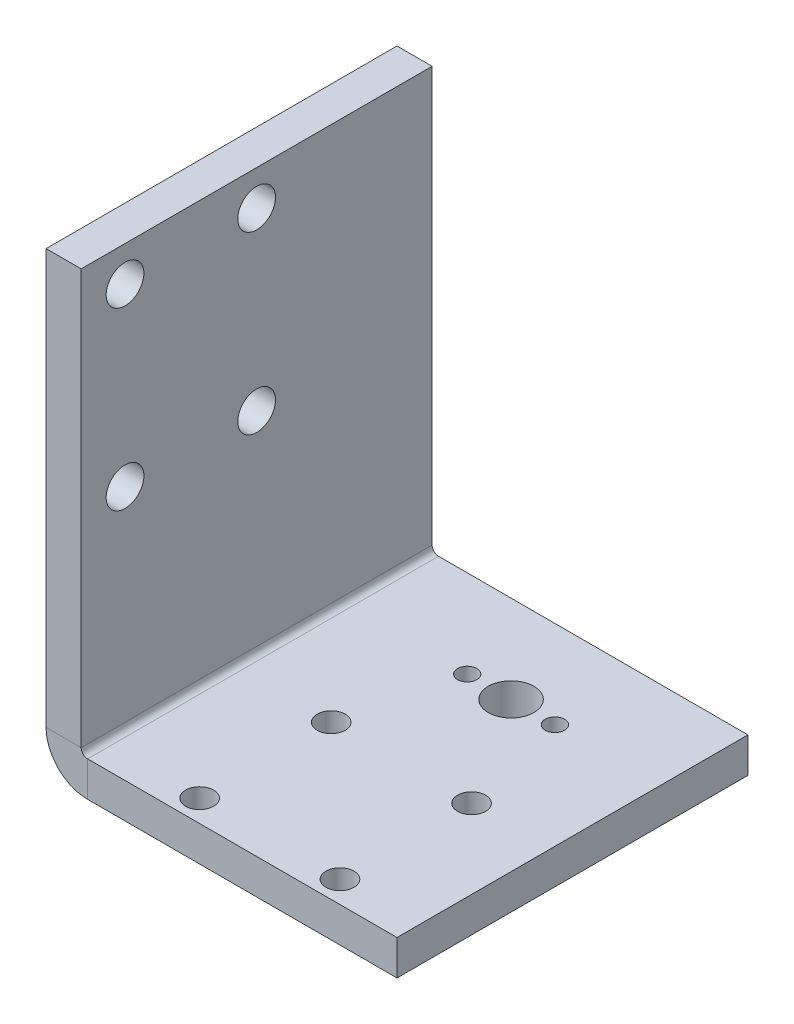
ISO-10303-21;
HEADER;
FILE_DESCRIPTION(('STEP AP214'),'2;1');
FILE_NAME('part.step','',(''),(''),'','','');
FILE_SCHEMA(('AUTOMOTIVE_DESIGN { 1 0 10303 214 1 1 1 1 }'));
ENDSEC;
DATA;
#1=APPLICATION_CONTEXT('core data for automotive mechanical design processes');
#2=APPLICATION_PROTOCOL_DEFINITION('international standard','automotive_design',2000,#1);
#3=PRODUCT_CONTEXT('',#1,'mechanical');
#4=PRODUCT('Part','Part','',(#3));
#5=PRODUCT_RELATED_PRODUCT_CATEGORY('part','',(#4));
#6=PRODUCT_DEFINITION_FORMATION('','',#4);
#7=PRODUCT_DEFINITION_CONTEXT('part definition',#1,'design');
#8=PRODUCT_DEFINITION('design','',#6,#7);
#9=PRODUCT_DEFINITION_SHAPE('','',#8);
#10=(LENGTH_UNIT() NAMED_UNIT(*) SI_UNIT(.MILLI.,.METRE.));
#11=(NAMED_UNIT(*) PLANE_ANGLE_UNIT() SI_UNIT($,.RADIAN.));
#12=(NAMED_UNIT(*) SI_UNIT($,.STERADIAN.) SOLID_ANGLE_UNIT());
#13=UNCERTAINTY_MEASURE_WITH_UNIT(LENGTH_MEASURE(1.E-05),#10,'distance_accuracy_value','');
#14=(GEOMETRIC_REPRESENTATION_CONTEXT(3) GLOBAL_UNCERTAINTY_ASSIGNED_CONTEXT((#13)) GLOBAL_UNIT_ASSIGNED_CONTEXT((#10,
#11,#12)) REPRESENTATION_CONTEXT('',''));
#15=CARTESIAN_POINT('',(0.,0.,0.));
#16=DIRECTION('',(0.,0.,1.));
#17=DIRECTION('',(1.,0.,0.));
#18=AXIS2_PLACEMENT_3D('',#15,#16,#17);
#19=CARTESIAN_POINT('',(0.7366,0.,20.));
#20=DIRECTION('',(0.,0.,1.));
#21=DIRECTION('',(1.,0.,0.));
#22=AXIS2_PLACEMENT_3D('',#19,#20,#21);
#23=PLANE('',#22);
#24=DIRECTION('',(0.,-1.,0.));
#25=VECTOR('',#24,1.);
#26=CARTESIAN_POINT('',(0.7366,0.,20.));
#27=LINE('',#26,#25);
#28=CARTESIAN_POINT('',(0.7366,0.,20.));
#29=VERTEX_POINT('',#28);
#30=CARTESIAN_POINT('',(0.7366,-4.,20.));
#31=VERTEX_POINT('',#30);
#32=EDGE_CURVE('E11',#29,#31,#27,.T.);
#33=ORIENTED_EDGE('',*,*,#32,.F.);
#34=CARTESIAN_POINT('',(0.7366,0.7366,20.));
#35=DIRECTION('',(0.,0.,-1.));
#36=DIRECTION('',(-1.,0.,0.));
#37=AXIS2_PLACEMENT_3D('',#34,#35,#36);
#38=CIRCLE('',#37,0.7366);
#39=CARTESIAN_POINT('',(0.,0.7366,20.));
#40=VERTEX_POINT('',#39);
#41=EDGE_CURVE('E138',#40,#29,#38,.F.);
#42=ORIENTED_EDGE('',*,*,#41,.F.);
#43=DIRECTION('',(1.,0.,0.));
#44=VECTOR('',#43,1.);
#45=CARTESIAN_POINT('',(-4.,0.736600000000001,20.));
#46=LINE('',#45,#44);
#47=CARTESIAN_POINT('',(-4.,0.736600000000001,20.));
#48=VERTEX_POINT('',#47);
#49=EDGE_CURVE('E48',#48,#40,#46,.T.);
#50=ORIENTED_EDGE('',*,*,#49,.F.);
#51=CARTESIAN_POINT('',(0.7366,0.7366,20.));
#52=DIRECTION('',(0.,0.,1.));
#53=DIRECTION('',(1.,0.,0.));
#54=AXIS2_PLACEMENT_3D('',#51,#52,#53);
#55=CIRCLE('',#54,4.7366);
#56=EDGE_CURVE('E131',#48,#31,#55,.T.);
#57=ORIENTED_EDGE('',*,*,#56,.T.);
#58=EDGE_LOOP('',(#33,#42,#50,#57));
#59=FACE_BOUND('',#58,.T.);
#60=ADVANCED_FACE('F39',(#59),#23,.T.);
#61=CARTESIAN_POINT('',(-4.,0.736600000000001,20.));
#62=DIRECTION('',(0.,0.,1.));
#63=DIRECTION('',(1.,0.,0.));
#64=AXIS2_PLACEMENT_3D('',#61,#62,#63);
#65=PLANE('',#64);
#66=DIRECTION('',(1.,0.,0.));
#67=VECTOR('',#66,1.);
#68=CARTESIAN_POINT('',(0.,0.,20.));
#69=LINE('',#68,#67);
#70=CARTESIAN_POINT('',(36.,0.,20.));
#71=VERTEX_POINT('',#70);
#72=EDGE_CURVE('E221',#29,#71,#69,.T.);
#73=ORIENTED_EDGE('',*,*,#72,.F.);
#74=ORIENTED_EDGE('',*,*,#32,.T.);
#75=DIRECTION('',(1.,0.,0.));
#76=VECTOR('',#75,1.);
#77=CARTESIAN_POINT('',(0.,-4.,20.));
#78=LINE('',#77,#76);
#79=CARTESIAN_POINT('',(36.,-4.,20.));
#80=VERTEX_POINT('',#79);
#81=EDGE_CURVE('E97',#31,#80,#78,.T.);
#82=ORIENTED_EDGE('',*,*,#81,.T.);
#83=DIRECTION('',(0.,-1.,0.));
#84=VECTOR('',#83,1.);
#85=CARTESIAN_POINT('',(36.,0.,20.));
#86=LINE('',#85,#84);
#87=EDGE_CURVE('E218',#71,#80,#86,.T.);
#88=ORIENTED_EDGE('',*,*,#87,.F.);
#89=EDGE_LOOP('',(#73,#74,#82,#88));
#90=FACE_BOUND('',#89,.T.);
#91=ADVANCED_FACE('F241',(#90),#65,.T.);
#92=CARTESIAN_POINT('',(0.,0.7366,-20.));
#93=DIRECTION('',(0.,0.,-1.));
#94=DIRECTION('',(-1.,0.,0.));
#95=AXIS2_PLACEMENT_3D('',#92,#93,#94);
#96=PLANE('',#95);
#97=DIRECTION('',(-1.,0.,0.));
#98=VECTOR('',#97,1.);
#99=CARTESIAN_POINT('',(0.,0.7366,-20.));
#100=LINE('',#99,#98);
#101=CARTESIAN_POINT('',(0.,0.7366,-20.));
#102=VERTEX_POINT('',#101);
#103=CARTESIAN_POINT('',(-4.,0.736600000000001,-20.));
#104=VERTEX_POINT('',#103);
#105=EDGE_CURVE('E84',#102,#104,#100,.T.);
#106=ORIENTED_EDGE('',*,*,#105,.F.);
#107=CARTESIAN_POINT('',(0.7366,0.7366,-20.));
#108=DIRECTION('',(0.,0.,-1.));
#109=DIRECTION('',(-1.,0.,0.));
#110=AXIS2_PLACEMENT_3D('',#107,#108,#109);
#111=CIRCLE('',#110,0.7366);
#112=CARTESIAN_POINT('',(0.7366,0.,-20.));
#113=VERTEX_POINT('',#112);
#114=EDGE_CURVE('E154',#102,#113,#111,.F.);
#115=ORIENTED_EDGE('',*,*,#114,.T.);
#116=DIRECTION('',(0.,1.,0.));
#117=VECTOR('',#116,1.);
#118=CARTESIAN_POINT('',(0.7366,-4.,-20.));
#119=LINE('',#118,#117);
#120=CARTESIAN_POINT('',(0.7366,-4.,-20.));
#121=VERTEX_POINT('',#120);
#122=EDGE_CURVE('E91',#121,#113,#119,.T.);
#123=ORIENTED_EDGE('',*,*,#122,.F.);
#124=CARTESIAN_POINT('',(0.7366,0.7366,-20.));
#125=DIRECTION('',(0.,0.,1.));
#126=DIRECTION('',(1.,0.,0.));
#127=AXIS2_PLACEMENT_3D('',#124,#125,#126);
#128=CIRCLE('',#127,4.7366);
#129=EDGE_CURVE('E161',#104,#121,#128,.T.);
#130=ORIENTED_EDGE('',*,*,#129,.F.);
#131=EDGE_LOOP('',(#106,#115,#123,#130));
#132=FACE_BOUND('',#131,.T.);
#133=ADVANCED_FACE('F239',(#132),#96,.T.);
#134=CARTESIAN_POINT('',(0.7366,-4.,-20.));
#135=DIRECTION('',(0.,0.,-1.));
#136=DIRECTION('',(-1.,0.,0.));
#137=AXIS2_PLACEMENT_3D('',#134,#135,#136);
#138=PLANE('',#137);
#139=DIRECTION('',(0.,-1.,0.));
#140=VECTOR('',#139,1.);
#141=CARTESIAN_POINT('',(0.,0.,-20.));
#142=LINE('',#141,#140);
#143=CARTESIAN_POINT('',(0.,48.,-20.));
#144=VERTEX_POINT('',#143);
#145=EDGE_CURVE('E156',#144,#102,#142,.T.);
#146=ORIENTED_EDGE('',*,*,#145,.T.);
#147=ORIENTED_EDGE('',*,*,#105,.T.);
#148=DIRECTION('',(0.,1.,0.));
#149=VECTOR('',#148,1.);
#150=CARTESIAN_POINT('',(-4.,0.,-20.));
#151=LINE('',#150,#149);
#152=CARTESIAN_POINT('',(-4.,48.,-20.));
#153=VERTEX_POINT('',#152);
#154=EDGE_CURVE('E159',#153,#104,#151,.F.);
#155=ORIENTED_EDGE('',*,*,#154,.F.);
#156=DIRECTION('',(1.,0.,0.));
#157=VECTOR('',#156,1.);
#158=CARTESIAN_POINT('',(-4.,48.,-20.));
#159=LINE('',#158,#157);
#160=EDGE_CURVE('E119',#153,#144,#159,.T.);
#161=ORIENTED_EDGE('',*,*,#160,.T.);
#162=EDGE_LOOP('',(#146,#147,#155,#161));
#163=FACE_BOUND('',#162,.T.);
#164=ADVANCED_FACE('F235',(#163),#138,.T.);
#165=CARTESIAN_POINT('',(0.,-4.,20.));
#166=DIRECTION('',(0.,1.,0.));
#167=DIRECTION('',(0.,0.,1.));
#168=AXIS2_PLACEMENT_3D('',#165,#166,#167);
#169=PLANE('',#168);
#170=CARTESIAN_POINT('',(14.,-4.,-10.));
#171=DIRECTION('',(0.,-1.,0.));
#172=DIRECTION('',(0.,0.,-1.));
#173=AXIS2_PLACEMENT_3D('',#170,#171,#172);
#174=CIRCLE('',#173,1.09999999999999);
#175=CARTESIAN_POINT('',(14.,-4.,-11.1));
#176=VERTEX_POINT('',#175);
#177=EDGE_CURVE('E488',#176,#176,#174,.T.);
#178=ORIENTED_EDGE('',*,*,#177,.F.);
#179=EDGE_LOOP('',(#178));
#180=FACE_BOUND('',#179,.T.);
#181=CARTESIAN_POINT('',(24.,-4.,-10.));
#182=DIRECTION('',(0.,-1.,0.));
#183=DIRECTION('',(0.,0.,-1.));
#184=AXIS2_PLACEMENT_3D('',#181,#182,#183);
#185=CIRCLE('',#184,1.09999999999999);
#186=CARTESIAN_POINT('',(24.,-4.,-11.1));
#187=VERTEX_POINT('',#186);
#188=EDGE_CURVE('E490',#187,#187,#185,.T.);
#189=ORIENTED_EDGE('',*,*,#188,.F.);
#190=EDGE_LOOP('',(#189));
#191=FACE_BOUND('',#190,.T.);
#192=CARTESIAN_POINT('',(19.,-4.,-10.));
#193=DIRECTION('',(0.,-1.,0.));
#194=DIRECTION('',(0.,0.,-1.));
#195=AXIS2_PLACEMENT_3D('',#192,#193,#194);
#196=CIRCLE('',#195,2.6);
#197=CARTESIAN_POINT('',(19.,-4.,-12.6));
#198=VERTEX_POINT('',#197);
#199=EDGE_CURVE('E182',#198,#198,#196,.T.);
#200=ORIENTED_EDGE('',*,*,#199,.F.);
#201=EDGE_LOOP('',(#200));
#202=FACE_BOUND('',#201,.T.);
#203=CARTESIAN_POINT('',(27.,-4.,17.5));
#204=DIRECTION('',(0.,1.,0.));
#205=DIRECTION('',(0.,0.,1.));
#206=AXIS2_PLACEMENT_3D('',#203,#204,#205);
#207=CIRCLE('',#206,1.59999999999999);
#208=CARTESIAN_POINT('',(27.,-4.,19.1));
#209=VERTEX_POINT('',#208);
#210=EDGE_CURVE('E186',#209,#209,#207,.T.);
#211=ORIENTED_EDGE('',*,*,#210,.T.);
#212=EDGE_LOOP('',(#211));
#213=FACE_BOUND('',#212,.T.);
#214=CARTESIAN_POINT('',(11.,-4.,2.5));
#215=DIRECTION('',(0.,1.,0.));
#216=DIRECTION('',(0.,0.,1.));
#217=AXIS2_PLACEMENT_3D('',#214,#215,#216);
#218=CIRCLE('',#217,1.59999999999999);
#219=CARTESIAN_POINT('',(11.,-4.,4.09999999999999));
#220=VERTEX_POINT('',#219);
#221=EDGE_CURVE('E203',#220,#220,#218,.T.);
#222=ORIENTED_EDGE('',*,*,#221,.T.);
#223=EDGE_LOOP('',(#222));
#224=FACE_BOUND('',#223,.T.);
#225=CARTESIAN_POINT('',(11.,-4.,17.5));
#226=DIRECTION('',(0.,1.,0.));
#227=DIRECTION('',(0.,0.,1.));
#228=AXIS2_PLACEMENT_3D('',#225,#226,#227);
#229=CIRCLE('',#228,1.59999999999999);
#230=CARTESIAN_POINT('',(11.,-4.,19.1));
#231=VERTEX_POINT('',#230);
#232=EDGE_CURVE('E209',#231,#231,#229,.T.);
#233=ORIENTED_EDGE('',*,*,#232,.T.);
#234=EDGE_LOOP('',(#233));
#235=FACE_BOUND('',#234,.T.);
#236=CARTESIAN_POINT('',(27.,-4.,2.5));
#237=DIRECTION('',(0.,1.,0.));
#238=DIRECTION('',(0.,0.,1.));
#239=AXIS2_PLACEMENT_3D('',#236,#237,#238);
#240=CIRCLE('',#239,1.59999999999999);
#241=CARTESIAN_POINT('',(27.,-4.,4.09999999999999));
#242=VERTEX_POINT('',#241);
#243=EDGE_CURVE('E148',#242,#242,#240,.T.);
#244=ORIENTED_EDGE('',*,*,#243,.T.);
#245=EDGE_LOOP('',(#244));
#246=FACE_BOUND('',#245,.T.);
#247=DIRECTION('',(1.,0.,0.));
#248=VECTOR('',#247,1.);
#249=CARTESIAN_POINT('',(0.,-4.,-20.));
#250=LINE('',#249,#248);
#251=CARTESIAN_POINT('',(36.,-4.,-20.));
#252=VERTEX_POINT('',#251);
#253=EDGE_CURVE('E144',#121,#252,#250,.T.);
#254=ORIENTED_EDGE('',*,*,#253,.T.);
#255=DIRECTION('',(0.,0.,-1.));
#256=VECTOR('',#255,1.);
#257=CARTESIAN_POINT('',(36.,-4.,20.));
#258=LINE('',#257,#256);
#259=EDGE_CURVE('E175',#80,#252,#258,.T.);
#260=ORIENTED_EDGE('',*,*,#259,.F.);
#261=ORIENTED_EDGE('',*,*,#81,.F.);
#262=DIRECTION('',(0.,0.,-1.));
#263=VECTOR('',#262,1.);
#264=CARTESIAN_POINT('',(0.7366,-4.,20.));
#265=LINE('',#264,#263);
#266=EDGE_CURVE('E143',#31,#121,#265,.T.);
#267=ORIENTED_EDGE('',*,*,#266,.T.);
#268=EDGE_LOOP('',(#254,#260,#261,#267));
#269=FACE_BOUND('',#268,.T.);
#270=ADVANCED_FACE('F247',(#180,#191,#202,#213,#224,#235,#246,#269),#169,.F.);
#271=CARTESIAN_POINT('',(36.,0.,20.));
#272=DIRECTION('',(1.,0.,0.));
#273=DIRECTION('',(0.,0.,-1.));
#274=AXIS2_PLACEMENT_3D('',#271,#272,#273);
#275=PLANE('',#274);
#276=DIRECTION('',(0.,-1.,0.));
#277=VECTOR('',#276,1.);
#278=CARTESIAN_POINT('',(36.,0.,-20.));
#279=LINE('',#278,#277);
#280=CARTESIAN_POINT('',(36.,0.,-20.));
#281=VERTEX_POINT('',#280);
#282=EDGE_CURVE('E147',#281,#252,#279,.T.);
#283=ORIENTED_EDGE('',*,*,#282,.F.);
#284=DIRECTION('',(0.,0.,-1.));
#285=VECTOR('',#284,1.);
#286=CARTESIAN_POINT('',(36.,0.,20.));
#287=LINE('',#286,#285);
#288=EDGE_CURVE('E173',#71,#281,#287,.T.);
#289=ORIENTED_EDGE('',*,*,#288,.F.);
#290=ORIENTED_EDGE('',*,*,#87,.T.);
#291=ORIENTED_EDGE('',*,*,#259,.T.);
#292=EDGE_LOOP('',(#283,#289,#290,#291));
#293=FACE_BOUND('',#292,.T.);
#294=ADVANCED_FACE('F276',(#293),#275,.T.);
#295=CARTESIAN_POINT('',(0.,0.,20.));
#296=DIRECTION('',(0.,1.,0.));
#297=DIRECTION('',(0.,0.,1.));
#298=AXIS2_PLACEMENT_3D('',#295,#296,#297);
#299=PLANE('',#298);
#300=CARTESIAN_POINT('',(14.,0.,-10.));
#301=DIRECTION('',(0.,1.,0.));
#302=DIRECTION('',(0.,0.,1.));
#303=AXIS2_PLACEMENT_3D('',#300,#301,#302);
#304=CIRCLE('',#303,1.09999999999999);
#305=CARTESIAN_POINT('',(14.,0.,-8.90000000000001));
#306=VERTEX_POINT('',#305);
#307=EDGE_CURVE('E485',#306,#306,#304,.T.);
#308=ORIENTED_EDGE('',*,*,#307,.F.);
#309=EDGE_LOOP('',(#308));
#310=FACE_BOUND('',#309,.T.);
#311=CARTESIAN_POINT('',(24.,0.,-10.));
#312=DIRECTION('',(0.,1.,0.));
#313=DIRECTION('',(0.,0.,1.));
#314=AXIS2_PLACEMENT_3D('',#311,#312,#313);
#315=CIRCLE('',#314,1.09999999999999);
#316=CARTESIAN_POINT('',(24.,0.,-8.90000000000001));
#317=VERTEX_POINT('',#316);
#318=EDGE_CURVE('E42',#317,#317,#315,.T.);
#319=ORIENTED_EDGE('',*,*,#318,.F.);
#320=EDGE_LOOP('',(#319));
#321=FACE_BOUND('',#320,.T.);
#322=CARTESIAN_POINT('',(19.,0.,-10.));
#323=DIRECTION('',(0.,1.,0.));
#324=DIRECTION('',(0.,0.,1.));
#325=AXIS2_PLACEMENT_3D('',#322,#323,#324);
#326=CIRCLE('',#325,2.6);
#327=CARTESIAN_POINT('',(19.,0.,-7.4));
#328=VERTEX_POINT('',#327);
#329=EDGE_CURVE('E179',#328,#328,#326,.T.);
#330=ORIENTED_EDGE('',*,*,#329,.F.);
#331=EDGE_LOOP('',(#330));
#332=FACE_BOUND('',#331,.T.);
#333=CARTESIAN_POINT('',(27.,0.,17.5));
#334=DIRECTION('',(0.,1.,0.));
#335=DIRECTION('',(0.,0.,1.));
#336=AXIS2_PLACEMENT_3D('',#333,#334,#335);
#337=CIRCLE('',#336,1.59999999999999);
#338=CARTESIAN_POINT('',(27.,0.,19.1));
#339=VERTEX_POINT('',#338);
#340=EDGE_CURVE('E181',#339,#339,#337,.T.);
#341=ORIENTED_EDGE('',*,*,#340,.F.);
#342=EDGE_LOOP('',(#341));
#343=FACE_BOUND('',#342,.T.);
#344=CARTESIAN_POINT('',(11.,0.,2.5));
#345=DIRECTION('',(0.,1.,0.));
#346=DIRECTION('',(0.,0.,1.));
#347=AXIS2_PLACEMENT_3D('',#344,#345,#346);
#348=CIRCLE('',#347,1.59999999999999);
#349=CARTESIAN_POINT('',(11.,0.,4.09999999999998));
#350=VERTEX_POINT('',#349);
#351=EDGE_CURVE('E200',#350,#350,#348,.T.);
#352=ORIENTED_EDGE('',*,*,#351,.F.);
#353=EDGE_LOOP('',(#352));
#354=FACE_BOUND('',#353,.T.);
#355=CARTESIAN_POINT('',(11.,0.,17.5));
#356=DIRECTION('',(0.,1.,0.));
#357=DIRECTION('',(0.,0.,1.));
#358=AXIS2_PLACEMENT_3D('',#355,#356,#357);
#359=CIRCLE('',#358,1.59999999999999);
#360=CARTESIAN_POINT('',(11.,0.,19.1));
#361=VERTEX_POINT('',#360);
#362=EDGE_CURVE('E206',#361,#361,#359,.T.);
#363=ORIENTED_EDGE('',*,*,#362,.F.);
#364=EDGE_LOOP('',(#363));
#365=FACE_BOUND('',#364,.T.);
#366=CARTESIAN_POINT('',(27.,0.,2.5));
#367=DIRECTION('',(0.,1.,0.));
#368=DIRECTION('',(0.,0.,1.));
#369=AXIS2_PLACEMENT_3D('',#366,#367,#368);
#370=CIRCLE('',#369,1.59999999999999);
#371=CARTESIAN_POINT('',(27.,0.,4.09999999999999));
#372=VERTEX_POINT('',#371);
#373=EDGE_CURVE('E212',#372,#372,#370,.T.);
#374=ORIENTED_EDGE('',*,*,#373,.F.);
#375=EDGE_LOOP('',(#374));
#376=FACE_BOUND('',#375,.T.);
#377=DIRECTION('',(1.,0.,0.));
#378=VECTOR('',#377,1.);
#379=CARTESIAN_POINT('',(0.,0.,-20.));
#380=LINE('',#379,#378);
#381=EDGE_CURVE('E151',#113,#281,#380,.T.);
#382=ORIENTED_EDGE('',*,*,#381,.F.);
#383=DIRECTION('',(0.,0.,-1.));
#384=VECTOR('',#383,1.);
#385=CARTESIAN_POINT('',(0.7366,0.,20.));
#386=LINE('',#385,#384);
#387=EDGE_CURVE('E170',#29,#113,#386,.T.);
#388=ORIENTED_EDGE('',*,*,#387,.F.);
#389=ORIENTED_EDGE('',*,*,#72,.T.);
#390=ORIENTED_EDGE('',*,*,#288,.T.);
#391=EDGE_LOOP('',(#382,#388,#389,#390));
#392=FACE_BOUND('',#391,.T.);
#393=ADVANCED_FACE('F281',(#310,#321,#332,#343,#354,#365,#376,#392),#299,.T.);
#394=CARTESIAN_POINT('',(0.7366,0.7366,20.));
#395=DIRECTION('',(0.,0.,-1.));
#396=DIRECTION('',(-1.,0.,0.));
#397=AXIS2_PLACEMENT_3D('',#394,#395,#396);
#398=CYLINDRICAL_SURFACE('',#397,0.7366);
#399=ORIENTED_EDGE('',*,*,#114,.F.);
#400=DIRECTION('',(0.,0.,-1.));
#401=VECTOR('',#400,1.);
#402=CARTESIAN_POINT('',(0.,0.7366,20.));
#403=LINE('',#402,#401);
#404=EDGE_CURVE('E167',#40,#102,#403,.T.);
#405=ORIENTED_EDGE('',*,*,#404,.F.);
#406=ORIENTED_EDGE('',*,*,#41,.T.);
#407=ORIENTED_EDGE('',*,*,#387,.T.);
#408=EDGE_LOOP('',(#399,#405,#406,#407));
#409=FACE_BOUND('',#408,.T.);
#410=ADVANCED_FACE('F228',(#409),#398,.F.);
#411=CARTESIAN_POINT('',(0.,0.,20.));
#412=DIRECTION('',(1.,0.,0.));
#413=DIRECTION('',(0.,0.,-1.));
#414=AXIS2_PLACEMENT_3D('',#411,#412,#413);
#415=PLANE('',#414);
#416=CARTESIAN_POINT('',(0.,44.,15.));
#417=DIRECTION('',(1.,0.,0.));
#418=DIRECTION('',(0.,0.,-1.));
#419=AXIS2_PLACEMENT_3D('',#416,#417,#418);
#420=CIRCLE('',#419,2.14999999999999);
#421=CARTESIAN_POINT('',(0.,44.,12.85));
#422=VERTEX_POINT('',#421);
#423=EDGE_CURVE('E495',#422,#422,#420,.T.);
#424=ORIENTED_EDGE('',*,*,#423,.F.);
#425=EDGE_LOOP('',(#424));
#426=FACE_BOUND('',#425,.T.);
#427=CARTESIAN_POINT('',(0.,24.,15.));
#428=DIRECTION('',(1.,0.,0.));
#429=DIRECTION('',(0.,0.,-1.));
#430=AXIS2_PLACEMENT_3D('',#427,#428,#429);
#431=CIRCLE('',#430,2.15);
#432=CARTESIAN_POINT('',(0.,24.,12.85));
#433=VERTEX_POINT('',#432);
#434=EDGE_CURVE('E501',#433,#433,#431,.T.);
#435=ORIENTED_EDGE('',*,*,#434,.F.);
#436=EDGE_LOOP('',(#435));
#437=FACE_BOUND('',#436,.T.);
#438=CARTESIAN_POINT('',(0.,24.,0.));
#439=DIRECTION('',(1.,0.,0.));
#440=DIRECTION('',(0.,0.,-1.));
#441=AXIS2_PLACEMENT_3D('',#438,#439,#440);
#442=CIRCLE('',#441,2.15);
#443=CARTESIAN_POINT('',(0.,24.,-2.14999999999999));
#444=VERTEX_POINT('',#443);
#445=EDGE_CURVE('E507',#444,#444,#442,.T.);
#446=ORIENTED_EDGE('',*,*,#445,.F.);
#447=EDGE_LOOP('',(#446));
#448=FACE_BOUND('',#447,.T.);
#449=CARTESIAN_POINT('',(0.,44.,0.));
#450=DIRECTION('',(1.,0.,0.));
#451=DIRECTION('',(0.,0.,-1.));
#452=AXIS2_PLACEMENT_3D('',#449,#450,#451);
#453=CIRCLE('',#452,2.14999999999999);
#454=CARTESIAN_POINT('',(0.,44.,-2.14999999999999));
#455=VERTEX_POINT('',#454);
#456=EDGE_CURVE('E194',#455,#455,#453,.T.);
#457=ORIENTED_EDGE('',*,*,#456,.F.);
#458=EDGE_LOOP('',(#457));
#459=FACE_BOUND('',#458,.T.);
#460=ORIENTED_EDGE('',*,*,#145,.F.);
#461=DIRECTION('',(0.,0.,-1.));
#462=VECTOR('',#461,1.);
#463=CARTESIAN_POINT('',(0.,48.,20.));
#464=LINE('',#463,#462);
#465=CARTESIAN_POINT('',(0.,48.,20.));
#466=VERTEX_POINT('',#465);
#467=EDGE_CURVE('E121',#466,#144,#464,.T.);
#468=ORIENTED_EDGE('',*,*,#467,.F.);
#469=DIRECTION('',(0.,-1.,0.));
#470=VECTOR('',#469,1.);
#471=CARTESIAN_POINT('',(0.,0.,20.));
#472=LINE('',#471,#470);
#473=EDGE_CURVE('E136',#466,#40,#472,.T.);
#474=ORIENTED_EDGE('',*,*,#473,.T.);
#475=ORIENTED_EDGE('',*,*,#404,.T.);
#476=EDGE_LOOP('',(#460,#468,#474,#475));
#477=FACE_BOUND('',#476,.T.);
#478=ADVANCED_FACE('F234',(#426,#437,#448,#459,#477),#415,.T.);
#479=CARTESIAN_POINT('',(-4.,48.,20.));
#480=DIRECTION('',(0.,1.,0.));
#481=DIRECTION('',(0.,0.,1.));
#482=AXIS2_PLACEMENT_3D('',#479,#480,#481);
#483=PLANE('',#482);
#484=ORIENTED_EDGE('',*,*,#160,.F.);
#485=DIRECTION('',(0.,0.,-1.));
#486=VECTOR('',#485,1.);
#487=CARTESIAN_POINT('',(-4.,48.,20.));
#488=LINE('',#487,#486);
#489=CARTESIAN_POINT('',(-4.,48.,20.));
#490=VERTEX_POINT('',#489);
#491=EDGE_CURVE('E113',#490,#153,#488,.T.);
#492=ORIENTED_EDGE('',*,*,#491,.F.);
#493=DIRECTION('',(1.,0.,0.));
#494=VECTOR('',#493,1.);
#495=CARTESIAN_POINT('',(-4.,48.,20.));
#496=LINE('',#495,#494);
#497=EDGE_CURVE('E117',#490,#466,#496,.T.);
#498=ORIENTED_EDGE('',*,*,#497,.T.);
#499=ORIENTED_EDGE('',*,*,#467,.T.);
#500=EDGE_LOOP('',(#484,#492,#498,#499));
#501=FACE_BOUND('',#500,.T.);
#502=ADVANCED_FACE('F115',(#501),#483,.T.);
#503=CARTESIAN_POINT('',(-4.,0.,20.));
#504=DIRECTION('',(1.,0.,0.));
#505=DIRECTION('',(0.,0.,-1.));
#506=AXIS2_PLACEMENT_3D('',#503,#504,#505);
#507=PLANE('',#506);
#508=CARTESIAN_POINT('',(-4.,44.,15.));
#509=DIRECTION('',(1.,0.,0.));
#510=DIRECTION('',(0.,0.,-1.));
#511=AXIS2_PLACEMENT_3D('',#508,#509,#510);
#512=CIRCLE('',#511,2.14999999999999);
#513=CARTESIAN_POINT('',(-4.,44.,12.85));
#514=VERTEX_POINT('',#513);
#515=EDGE_CURVE('E498',#514,#514,#512,.T.);
#516=ORIENTED_EDGE('',*,*,#515,.T.);
#517=EDGE_LOOP('',(#516));
#518=FACE_BOUND('',#517,.T.);
#519=CARTESIAN_POINT('',(-4.,24.,15.));
#520=DIRECTION('',(1.,0.,0.));
#521=DIRECTION('',(0.,0.,-1.));
#522=AXIS2_PLACEMENT_3D('',#519,#520,#521);
#523=CIRCLE('',#522,2.15);
#524=CARTESIAN_POINT('',(-4.,24.,12.85));
#525=VERTEX_POINT('',#524);
#526=EDGE_CURVE('E504',#525,#525,#523,.T.);
#527=ORIENTED_EDGE('',*,*,#526,.T.);
#528=EDGE_LOOP('',(#527));
#529=FACE_BOUND('',#528,.T.);
#530=CARTESIAN_POINT('',(-4.,24.,0.));
#531=DIRECTION('',(1.,0.,0.));
#532=DIRECTION('',(0.,0.,-1.));
#533=AXIS2_PLACEMENT_3D('',#530,#531,#532);
#534=CIRCLE('',#533,2.15);
#535=CARTESIAN_POINT('',(-4.,24.,-2.14999999999999));
#536=VERTEX_POINT('',#535);
#537=EDGE_CURVE('E510',#536,#536,#534,.T.);
#538=ORIENTED_EDGE('',*,*,#537,.T.);
#539=EDGE_LOOP('',(#538));
#540=FACE_BOUND('',#539,.T.);
#541=CARTESIAN_POINT('',(-4.,44.,0.));
#542=DIRECTION('',(1.,0.,0.));
#543=DIRECTION('',(0.,0.,-1.));
#544=AXIS2_PLACEMENT_3D('',#541,#542,#543);
#545=CIRCLE('',#544,2.14999999999999);
#546=CARTESIAN_POINT('',(-4.,44.,-2.14999999999999));
#547=VERTEX_POINT('',#546);
#548=EDGE_CURVE('E189',#547,#547,#545,.T.);
#549=ORIENTED_EDGE('',*,*,#548,.T.);
#550=EDGE_LOOP('',(#549));
#551=FACE_BOUND('',#550,.T.);
#552=ORIENTED_EDGE('',*,*,#154,.T.);
#553=DIRECTION('',(0.,0.,-1.));
#554=VECTOR('',#553,1.);
#555=CARTESIAN_POINT('',(-4.,0.736600000000001,20.));
#556=LINE('',#555,#554);
#557=EDGE_CURVE('E122',#48,#104,#556,.T.);
#558=ORIENTED_EDGE('',*,*,#557,.F.);
#559=DIRECTION('',(0.,1.,0.));
#560=VECTOR('',#559,1.);
#561=CARTESIAN_POINT('',(-4.,0.,20.));
#562=LINE('',#561,#560);
#563=EDGE_CURVE('E126',#490,#48,#562,.F.);
#564=ORIENTED_EDGE('',*,*,#563,.F.);
#565=ORIENTED_EDGE('',*,*,#491,.T.);
#566=EDGE_LOOP('',(#552,#558,#564,#565));
#567=FACE_BOUND('',#566,.T.);
#568=ADVANCED_FACE('F127',(#518,#529,#540,#551,#567),#507,.F.);
#569=CARTESIAN_POINT('',(0.7366,0.7366,20.));
#570=DIRECTION('',(0.,0.,-1.));
#571=DIRECTION('',(-1.,0.,0.));
#572=AXIS2_PLACEMENT_3D('',#569,#570,#571);
#573=CYLINDRICAL_SURFACE('',#572,4.7366);
#574=ORIENTED_EDGE('',*,*,#129,.T.);
#575=ORIENTED_EDGE('',*,*,#266,.F.);
#576=ORIENTED_EDGE('',*,*,#56,.F.);
#577=ORIENTED_EDGE('',*,*,#557,.T.);
#578=EDGE_LOOP('',(#574,#575,#576,#577));
#579=FACE_BOUND('',#578,.T.);
#580=ADVANCED_FACE('F237',(#579),#573,.T.);
#581=CARTESIAN_POINT('',(0.7366,0.7366,20.));
#582=DIRECTION('',(0.,0.,-1.));
#583=DIRECTION('',(-1.,0.,0.));
#584=AXIS2_PLACEMENT_3D('',#581,#582,#583);
#585=PLANE('',#584);
#586=ORIENTED_EDGE('',*,*,#563,.T.);
#587=ORIENTED_EDGE('',*,*,#49,.T.);
#588=ORIENTED_EDGE('',*,*,#473,.F.);
#589=ORIENTED_EDGE('',*,*,#497,.F.);
#590=EDGE_LOOP('',(#586,#587,#588,#589));
#591=FACE_BOUND('',#590,.T.);
#592=ADVANCED_FACE('F134',(#591),#585,.F.);
#593=CARTESIAN_POINT('',(0.7366,0.7366,-20.));
#594=DIRECTION('',(0.,0.,-1.));
#595=DIRECTION('',(-1.,0.,0.));
#596=AXIS2_PLACEMENT_3D('',#593,#594,#595);
#597=PLANE('',#596);
#598=ORIENTED_EDGE('',*,*,#253,.F.);
#599=ORIENTED_EDGE('',*,*,#122,.T.);
#600=ORIENTED_EDGE('',*,*,#381,.T.);
#601=ORIENTED_EDGE('',*,*,#282,.T.);
#602=EDGE_LOOP('',(#598,#599,#600,#601));
#603=FACE_BOUND('',#602,.T.);
#604=ADVANCED_FACE('F325',(#603),#597,.T.);
#605=CARTESIAN_POINT('',(27.,0.,2.5));
#606=DIRECTION('',(0.,1.,0.));
#607=DIRECTION('',(0.,0.,1.));
#608=AXIS2_PLACEMENT_3D('',#605,#606,#607);
#609=CYLINDRICAL_SURFACE('',#608,1.59999999999999);
#610=ORIENTED_EDGE('',*,*,#243,.F.);
#611=EDGE_LOOP('',(#610));
#612=FACE_BOUND('',#611,.T.);
#613=ORIENTED_EDGE('',*,*,#373,.T.);
#614=EDGE_LOOP('',(#613));
#615=FACE_BOUND('',#614,.T.);
#616=ADVANCED_FACE('F335',(#612,#615),#609,.F.);
#617=CARTESIAN_POINT('',(11.,0.,17.5));
#618=DIRECTION('',(0.,1.,0.));
#619=DIRECTION('',(0.,0.,1.));
#620=AXIS2_PLACEMENT_3D('',#617,#618,#619);
#621=CYLINDRICAL_SURFACE('',#620,1.59999999999999);
#622=ORIENTED_EDGE('',*,*,#232,.F.);
#623=EDGE_LOOP('',(#622));
#624=FACE_BOUND('',#623,.T.);
#625=ORIENTED_EDGE('',*,*,#362,.T.);
#626=EDGE_LOOP('',(#625));
#627=FACE_BOUND('',#626,.T.);
#628=ADVANCED_FACE('F346',(#624,#627),#621,.F.);
#629=CARTESIAN_POINT('',(11.,0.,2.5));
#630=DIRECTION('',(0.,1.,0.));
#631=DIRECTION('',(0.,0.,1.));
#632=AXIS2_PLACEMENT_3D('',#629,#630,#631);
#633=CYLINDRICAL_SURFACE('',#632,1.59999999999999);
#634=ORIENTED_EDGE('',*,*,#221,.F.);
#635=EDGE_LOOP('',(#634));
#636=FACE_BOUND('',#635,.T.);
#637=ORIENTED_EDGE('',*,*,#351,.T.);
#638=EDGE_LOOP('',(#637));
#639=FACE_BOUND('',#638,.T.);
#640=ADVANCED_FACE('F356',(#636,#639),#633,.F.);
#641=CARTESIAN_POINT('',(27.,0.,17.5));
#642=DIRECTION('',(0.,1.,0.));
#643=DIRECTION('',(0.,0.,1.));
#644=AXIS2_PLACEMENT_3D('',#641,#642,#643);
#645=CYLINDRICAL_SURFACE('',#644,1.59999999999999);
#646=ORIENTED_EDGE('',*,*,#210,.F.);
#647=EDGE_LOOP('',(#646));
#648=FACE_BOUND('',#647,.T.);
#649=ORIENTED_EDGE('',*,*,#340,.T.);
#650=EDGE_LOOP('',(#649));
#651=FACE_BOUND('',#650,.T.);
#652=ADVANCED_FACE('F366',(#648,#651),#645,.F.);
#653=CARTESIAN_POINT('',(19.,48.,-10.));
#654=DIRECTION('',(0.,-1.,0.));
#655=DIRECTION('',(0.,0.,-1.));
#656=AXIS2_PLACEMENT_3D('',#653,#654,#655);
#657=CYLINDRICAL_SURFACE('',#656,2.6);
#658=ORIENTED_EDGE('',*,*,#329,.T.);
#659=EDGE_LOOP('',(#658));
#660=FACE_BOUND('',#659,.T.);
#661=ORIENTED_EDGE('',*,*,#199,.T.);
#662=EDGE_LOOP('',(#661));
#663=FACE_BOUND('',#662,.T.);
#664=ADVANCED_FACE('F376',(#660,#663),#657,.F.);
#665=CARTESIAN_POINT('',(0.,44.,0.));
#666=DIRECTION('',(1.,0.,0.));
#667=DIRECTION('',(0.,0.,-1.));
#668=AXIS2_PLACEMENT_3D('',#665,#666,#667);
#669=CYLINDRICAL_SURFACE('',#668,2.14999999999999);
#670=ORIENTED_EDGE('',*,*,#548,.F.);
#671=EDGE_LOOP('',(#670));
#672=FACE_BOUND('',#671,.T.);
#673=ORIENTED_EDGE('',*,*,#456,.T.);
#674=EDGE_LOOP('',(#673));
#675=FACE_BOUND('',#674,.T.);
#676=ADVANCED_FACE('F386',(#672,#675),#669,.F.);
#677=CARTESIAN_POINT('',(0.,24.,0.));
#678=DIRECTION('',(1.,0.,0.));
#679=DIRECTION('',(0.,0.,-1.));
#680=AXIS2_PLACEMENT_3D('',#677,#678,#679);
#681=CYLINDRICAL_SURFACE('',#680,2.15);
#682=ORIENTED_EDGE('',*,*,#537,.F.);
#683=EDGE_LOOP('',(#682));
#684=FACE_BOUND('',#683,.T.);
#685=ORIENTED_EDGE('',*,*,#445,.T.);
#686=EDGE_LOOP('',(#685));
#687=FACE_BOUND('',#686,.T.);
#688=ADVANCED_FACE('F412',(#684,#687),#681,.F.);
#689=CARTESIAN_POINT('',(0.,24.,15.));
#690=DIRECTION('',(1.,0.,0.));
#691=DIRECTION('',(0.,0.,-1.));
#692=AXIS2_PLACEMENT_3D('',#689,#690,#691);
#693=CYLINDRICAL_SURFACE('',#692,2.15);
#694=ORIENTED_EDGE('',*,*,#526,.F.);
#695=EDGE_LOOP('',(#694));
#696=FACE_BOUND('',#695,.T.);
#697=ORIENTED_EDGE('',*,*,#434,.T.);
#698=EDGE_LOOP('',(#697));
#699=FACE_BOUND('',#698,.T.);
#700=ADVANCED_FACE('F422',(#696,#699),#693,.F.);
#701=CARTESIAN_POINT('',(0.,44.,15.));
#702=DIRECTION('',(1.,0.,0.));
#703=DIRECTION('',(0.,0.,-1.));
#704=AXIS2_PLACEMENT_3D('',#701,#702,#703);
#705=CYLINDRICAL_SURFACE('',#704,2.14999999999999);
#706=ORIENTED_EDGE('',*,*,#515,.F.);
#707=EDGE_LOOP('',(#706));
#708=FACE_BOUND('',#707,.T.);
#709=ORIENTED_EDGE('',*,*,#423,.T.);
#710=EDGE_LOOP('',(#709));
#711=FACE_BOUND('',#710,.T.);
#712=ADVANCED_FACE('F432',(#708,#711),#705,.F.);
#713=CARTESIAN_POINT('',(24.,-4.,-10.));
#714=DIRECTION('',(0.,-1.,0.));
#715=DIRECTION('',(0.,0.,-1.));
#716=AXIS2_PLACEMENT_3D('',#713,#714,#715);
#717=CYLINDRICAL_SURFACE('',#716,1.09999999999999);
#718=ORIENTED_EDGE('',*,*,#318,.T.);
#719=EDGE_LOOP('',(#718));
#720=FACE_BOUND('',#719,.T.);
#721=ORIENTED_EDGE('',*,*,#188,.T.);
#722=EDGE_LOOP('',(#721));
#723=FACE_BOUND('',#722,.T.);
#724=ADVANCED_FACE('F442',(#720,#723),#717,.F.);
#725=CARTESIAN_POINT('',(14.,-4.,-10.));
#726=DIRECTION('',(0.,-1.,0.));
#727=DIRECTION('',(0.,0.,-1.));
#728=AXIS2_PLACEMENT_3D('',#725,#726,#727);
#729=CYLINDRICAL_SURFACE('',#728,1.09999999999999);
#730=ORIENTED_EDGE('',*,*,#307,.T.);
#731=EDGE_LOOP('',(#730));
#732=FACE_BOUND('',#731,.T.);
#733=ORIENTED_EDGE('',*,*,#177,.T.);
#734=EDGE_LOOP('',(#733));
#735=FACE_BOUND('',#734,.T.);
#736=ADVANCED_FACE('F468',(#732,#735),#729,.F.);
#737=CLOSED_SHELL('',(#60,#91,#133,#164,#270,#294,#393,#410,#478,#502,#568,#580,#592,#604,#616,
#628,#640,#652,#664,#676,#688,#700,#712,#724,#736));
#738=MANIFOLD_SOLID_BREP('B2',#737);
#739=ADVANCED_BREP_SHAPE_REPRESENTATION('',(#18,#738),#14);
#740=SHAPE_DEFINITION_REPRESENTATION(#9,#739);
ENDSEC;
END-ISO-10303-21;
